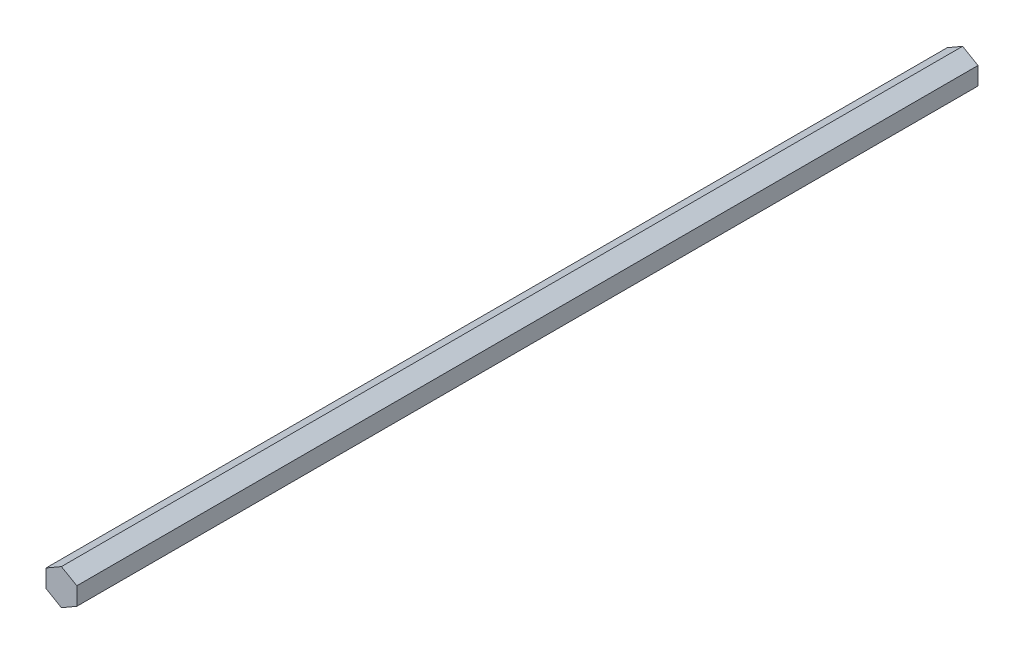
ISO-10303-21;
HEADER;
FILE_DESCRIPTION(('STEP AP214'),'2;1');
FILE_NAME('part.step','',(''),(''),'','','');
FILE_SCHEMA(('AUTOMOTIVE_DESIGN { 1 0 10303 214 1 1 1 1 }'));
ENDSEC;
DATA;
#1=APPLICATION_CONTEXT('core data for automotive mechanical design processes');
#2=APPLICATION_PROTOCOL_DEFINITION('international standard','automotive_design',2000,#1);
#3=PRODUCT_CONTEXT('',#1,'mechanical');
#4=PRODUCT('Part','Part','',(#3));
#5=PRODUCT_RELATED_PRODUCT_CATEGORY('part','',(#4));
#6=PRODUCT_DEFINITION_FORMATION('','',#4);
#7=PRODUCT_DEFINITION_CONTEXT('part definition',#1,'design');
#8=PRODUCT_DEFINITION('design','',#6,#7);
#9=PRODUCT_DEFINITION_SHAPE('','',#8);
#10=(LENGTH_UNIT() NAMED_UNIT(*) SI_UNIT(.MILLI.,.METRE.));
#11=(NAMED_UNIT(*) PLANE_ANGLE_UNIT() SI_UNIT($,.RADIAN.));
#12=(NAMED_UNIT(*) SI_UNIT($,.STERADIAN.) SOLID_ANGLE_UNIT());
#13=UNCERTAINTY_MEASURE_WITH_UNIT(LENGTH_MEASURE(1.E-05),#10,'distance_accuracy_value','');
#14=(GEOMETRIC_REPRESENTATION_CONTEXT(3) GLOBAL_UNCERTAINTY_ASSIGNED_CONTEXT((#13)) GLOBAL_UNIT_ASSIGNED_CONTEXT((#10,
#11,#12)) REPRESENTATION_CONTEXT('',''));
#15=CARTESIAN_POINT('',(0.,0.,0.));
#16=DIRECTION('',(0.,0.,1.));
#17=DIRECTION('',(1.,0.,0.));
#18=AXIS2_PLACEMENT_3D('',#15,#16,#17);
#19=CARTESIAN_POINT('',(-6.35,3.66617420935411,152.4));
#20=DIRECTION('',(1.,0.,0.));
#21=DIRECTION('',(0.,0.,-1.));
#22=AXIS2_PLACEMENT_3D('',#19,#20,#21);
#23=PLANE('',#22);
#24=DIRECTION('',(0.,0.,-1.));
#25=VECTOR('',#24,1.);
#26=CARTESIAN_POINT('',(-6.35,3.66617420935411,152.4));
#27=LINE('',#26,#25);
#28=CARTESIAN_POINT('',(-6.35,3.66617420935411,218.948));
#29=VERTEX_POINT('',#28);
#30=CARTESIAN_POINT('',(-6.35,3.66617420935411,-152.4));
#31=VERTEX_POINT('',#30);
#32=EDGE_CURVE('E58',#29,#31,#27,.T.);
#33=ORIENTED_EDGE('',*,*,#32,.T.);
#34=DIRECTION('',(0.,-1.,0.));
#35=VECTOR('',#34,1.);
#36=CARTESIAN_POINT('',(-6.35,3.66617420935411,-152.4));
#37=LINE('',#36,#35);
#38=CARTESIAN_POINT('',(-6.35,-3.66617420935413,-152.4));
#39=VERTEX_POINT('',#38);
#40=EDGE_CURVE('E128',#31,#39,#37,.T.);
#41=ORIENTED_EDGE('',*,*,#40,.T.);
#42=DIRECTION('',(0.,0.,-1.));
#43=VECTOR('',#42,1.);
#44=CARTESIAN_POINT('',(-6.35,-3.66617420935413,152.4));
#45=LINE('',#44,#43);
#46=CARTESIAN_POINT('',(-6.35,-3.66617420935413,218.948));
#47=VERTEX_POINT('',#46);
#48=EDGE_CURVE('E11',#47,#39,#45,.T.);
#49=ORIENTED_EDGE('',*,*,#48,.F.);
#50=DIRECTION('',(0.,-1.,0.));
#51=VECTOR('',#50,1.);
#52=CARTESIAN_POINT('',(-6.35,3.66617420935411,218.948));
#53=LINE('',#52,#51);
#54=EDGE_CURVE('E102',#29,#47,#53,.T.);
#55=ORIENTED_EDGE('',*,*,#54,.F.);
#56=EDGE_LOOP('',(#33,#41,#49,#55));
#57=FACE_BOUND('',#56,.T.);
#58=ADVANCED_FACE('F43',(#57),#23,.F.);
#59=CARTESIAN_POINT('',(-6.35,-3.66617420935413,152.4));
#60=DIRECTION('',(0.5,0.866025403784439,0.));
#61=DIRECTION('',(-0.866025403784439,0.5,0.));
#62=AXIS2_PLACEMENT_3D('',#59,#60,#61);
#63=PLANE('',#62);
#64=ORIENTED_EDGE('',*,*,#48,.T.);
#65=DIRECTION('',(0.866025403784439,-0.5,0.));
#66=VECTOR('',#65,1.);
#67=CARTESIAN_POINT('',(-6.35,-3.66617420935413,-152.4));
#68=LINE('',#67,#66);
#69=CARTESIAN_POINT('',(0.,-7.33234841870826,-152.4));
#70=VERTEX_POINT('',#69);
#71=EDGE_CURVE('E131',#39,#70,#68,.T.);
#72=ORIENTED_EDGE('',*,*,#71,.T.);
#73=DIRECTION('',(0.,0.,-1.));
#74=VECTOR('',#73,1.);
#75=CARTESIAN_POINT('',(0.,-7.33234841870826,152.4));
#76=LINE('',#75,#74);
#77=CARTESIAN_POINT('',(0.,-7.33234841870826,218.948));
#78=VERTEX_POINT('',#77);
#79=EDGE_CURVE('E51',#78,#70,#76,.T.);
#80=ORIENTED_EDGE('',*,*,#79,.F.);
#81=DIRECTION('',(0.866025403784439,-0.5,0.));
#82=VECTOR('',#81,1.);
#83=CARTESIAN_POINT('',(-6.35,-3.66617420935413,218.948));
#84=LINE('',#83,#82);
#85=EDGE_CURVE('E107',#47,#78,#84,.T.);
#86=ORIENTED_EDGE('',*,*,#85,.F.);
#87=EDGE_LOOP('',(#64,#72,#80,#86));
#88=FACE_BOUND('',#87,.T.);
#89=ADVANCED_FACE('F166',(#88),#63,.F.);
#90=CARTESIAN_POINT('',(0.,-7.33234841870826,152.4));
#91=DIRECTION('',(-0.5,0.866025403784439,0.));
#92=DIRECTION('',(-0.866025403784439,-0.5,0.));
#93=AXIS2_PLACEMENT_3D('',#90,#91,#92);
#94=PLANE('',#93);
#95=ORIENTED_EDGE('',*,*,#79,.T.);
#96=DIRECTION('',(0.866025403784439,0.5,0.));
#97=VECTOR('',#96,1.);
#98=CARTESIAN_POINT('',(0.,-7.33234841870826,-152.4));
#99=LINE('',#98,#97);
#100=CARTESIAN_POINT('',(6.35,-3.66617420935414,-152.4));
#101=VERTEX_POINT('',#100);
#102=EDGE_CURVE('E135',#70,#101,#99,.T.);
#103=ORIENTED_EDGE('',*,*,#102,.T.);
#104=DIRECTION('',(0.,0.,-1.));
#105=VECTOR('',#104,1.);
#106=CARTESIAN_POINT('',(6.35,-3.66617420935414,152.4));
#107=LINE('',#106,#105);
#108=CARTESIAN_POINT('',(6.35,-3.66617420935414,218.948));
#109=VERTEX_POINT('',#108);
#110=EDGE_CURVE('E153',#109,#101,#107,.T.);
#111=ORIENTED_EDGE('',*,*,#110,.F.);
#112=DIRECTION('',(0.866025403784439,0.5,0.));
#113=VECTOR('',#112,1.);
#114=CARTESIAN_POINT('',(0.,-7.33234841870826,218.948));
#115=LINE('',#114,#113);
#116=EDGE_CURVE('E119',#78,#109,#115,.T.);
#117=ORIENTED_EDGE('',*,*,#116,.F.);
#118=EDGE_LOOP('',(#95,#103,#111,#117));
#119=FACE_BOUND('',#118,.T.);
#120=ADVANCED_FACE('F159',(#119),#94,.F.);
#121=CARTESIAN_POINT('',(6.35,-3.66617420935414,152.4));
#122=DIRECTION('',(-1.,0.,0.));
#123=DIRECTION('',(0.,-1.,0.));
#124=AXIS2_PLACEMENT_3D('',#121,#122,#123);
#125=PLANE('',#124);
#126=ORIENTED_EDGE('',*,*,#110,.T.);
#127=DIRECTION('',(0.,1.,0.));
#128=VECTOR('',#127,1.);
#129=CARTESIAN_POINT('',(6.35,-3.66617420935414,-152.4));
#130=LINE('',#129,#128);
#131=CARTESIAN_POINT('',(6.35,3.66617420935412,-152.4));
#132=VERTEX_POINT('',#131);
#133=EDGE_CURVE('E139',#101,#132,#130,.T.);
#134=ORIENTED_EDGE('',*,*,#133,.T.);
#135=DIRECTION('',(0.,0.,-1.));
#136=VECTOR('',#135,1.);
#137=CARTESIAN_POINT('',(6.35,3.66617420935412,152.4));
#138=LINE('',#137,#136);
#139=CARTESIAN_POINT('',(6.35,3.66617420935412,218.948));
#140=VERTEX_POINT('',#139);
#141=EDGE_CURVE('E150',#140,#132,#138,.T.);
#142=ORIENTED_EDGE('',*,*,#141,.F.);
#143=DIRECTION('',(0.,1.,0.));
#144=VECTOR('',#143,1.);
#145=CARTESIAN_POINT('',(6.35,-3.66617420935414,218.948));
#146=LINE('',#145,#144);
#147=EDGE_CURVE('E123',#109,#140,#146,.T.);
#148=ORIENTED_EDGE('',*,*,#147,.F.);
#149=EDGE_LOOP('',(#126,#134,#142,#148));
#150=FACE_BOUND('',#149,.T.);
#151=ADVANCED_FACE('F169',(#150),#125,.F.);
#152=CARTESIAN_POINT('',(6.35,3.66617420935412,152.4));
#153=DIRECTION('',(-0.5,-0.866025403784439,0.));
#154=DIRECTION('',(0.866025403784439,-0.5,0.));
#155=AXIS2_PLACEMENT_3D('',#152,#153,#154);
#156=PLANE('',#155);
#157=ORIENTED_EDGE('',*,*,#141,.T.);
#158=DIRECTION('',(-0.866025403784439,0.5,0.));
#159=VECTOR('',#158,1.);
#160=CARTESIAN_POINT('',(6.35,3.66617420935412,-152.4));
#161=LINE('',#160,#159);
#162=CARTESIAN_POINT('',(0.,7.33234841870824,-152.4));
#163=VERTEX_POINT('',#162);
#164=EDGE_CURVE('E143',#132,#163,#161,.T.);
#165=ORIENTED_EDGE('',*,*,#164,.T.);
#166=DIRECTION('',(0.,0.,-1.));
#167=VECTOR('',#166,1.);
#168=CARTESIAN_POINT('',(0.,7.33234841870824,152.4));
#169=LINE('',#168,#167);
#170=CARTESIAN_POINT('',(0.,7.33234841870824,218.948));
#171=VERTEX_POINT('',#170);
#172=EDGE_CURVE('E66',#171,#163,#169,.T.);
#173=ORIENTED_EDGE('',*,*,#172,.F.);
#174=DIRECTION('',(-0.866025403784439,0.5,0.));
#175=VECTOR('',#174,1.);
#176=CARTESIAN_POINT('',(6.35,3.66617420935412,218.948));
#177=LINE('',#176,#175);
#178=EDGE_CURVE('E113',#140,#171,#177,.T.);
#179=ORIENTED_EDGE('',*,*,#178,.F.);
#180=EDGE_LOOP('',(#157,#165,#173,#179));
#181=FACE_BOUND('',#180,.T.);
#182=ADVANCED_FACE('F171',(#181),#156,.F.);
#183=CARTESIAN_POINT('',(0.,7.33234841870824,152.4));
#184=DIRECTION('',(0.5,-0.866025403784439,0.));
#185=DIRECTION('',(0.866025403784439,0.5,0.));
#186=AXIS2_PLACEMENT_3D('',#183,#184,#185);
#187=PLANE('',#186);
#188=ORIENTED_EDGE('',*,*,#172,.T.);
#189=DIRECTION('',(-0.866025403784439,-0.5,0.));
#190=VECTOR('',#189,1.);
#191=CARTESIAN_POINT('',(0.,7.33234841870824,-152.4));
#192=LINE('',#191,#190);
#193=EDGE_CURVE('E98',#163,#31,#192,.T.);
#194=ORIENTED_EDGE('',*,*,#193,.T.);
#195=ORIENTED_EDGE('',*,*,#32,.F.);
#196=DIRECTION('',(-0.866025403784439,-0.5,0.));
#197=VECTOR('',#196,1.);
#198=CARTESIAN_POINT('',(0.,7.33234841870824,218.948));
#199=LINE('',#198,#197);
#200=EDGE_CURVE('E96',#171,#29,#199,.T.);
#201=ORIENTED_EDGE('',*,*,#200,.F.);
#202=EDGE_LOOP('',(#188,#194,#195,#201));
#203=FACE_BOUND('',#202,.T.);
#204=ADVANCED_FACE('F94',(#203),#187,.F.);
#205=CARTESIAN_POINT('',(0.,0.,-152.4));
#206=DIRECTION('',(0.,0.,1.));
#207=DIRECTION('',(1.,0.,0.));
#208=AXIS2_PLACEMENT_3D('',#205,#206,#207);
#209=PLANE('',#208);
#210=ORIENTED_EDGE('',*,*,#40,.F.);
#211=ORIENTED_EDGE('',*,*,#193,.F.);
#212=ORIENTED_EDGE('',*,*,#164,.F.);
#213=ORIENTED_EDGE('',*,*,#133,.F.);
#214=ORIENTED_EDGE('',*,*,#102,.F.);
#215=ORIENTED_EDGE('',*,*,#71,.F.);
#216=EDGE_LOOP('',(#210,#211,#212,#213,#214,#215));
#217=FACE_BOUND('',#216,.T.);
#218=ADVANCED_FACE('F164',(#217),#209,.F.);
#219=CARTESIAN_POINT('',(0.,0.,218.948));
#220=DIRECTION('',(0.,0.,1.));
#221=DIRECTION('',(1.,0.,0.));
#222=AXIS2_PLACEMENT_3D('',#219,#220,#221);
#223=PLANE('',#222);
#224=ORIENTED_EDGE('',*,*,#200,.T.);
#225=ORIENTED_EDGE('',*,*,#54,.T.);
#226=ORIENTED_EDGE('',*,*,#85,.T.);
#227=ORIENTED_EDGE('',*,*,#116,.T.);
#228=ORIENTED_EDGE('',*,*,#147,.T.);
#229=ORIENTED_EDGE('',*,*,#178,.T.);
#230=EDGE_LOOP('',(#224,#225,#226,#227,#228,#229));
#231=FACE_BOUND('',#230,.T.);
#232=ADVANCED_FACE('F110',(#231),#223,.T.);
#233=CLOSED_SHELL('',(#58,#89,#120,#151,#182,#204,#218,#232));
#234=MANIFOLD_SOLID_BREP('B2',#233);
#235=ADVANCED_BREP_SHAPE_REPRESENTATION('',(#18,#234),#14);
#236=SHAPE_DEFINITION_REPRESENTATION(#9,#235);
ENDSEC;
END-ISO-10303-21;
